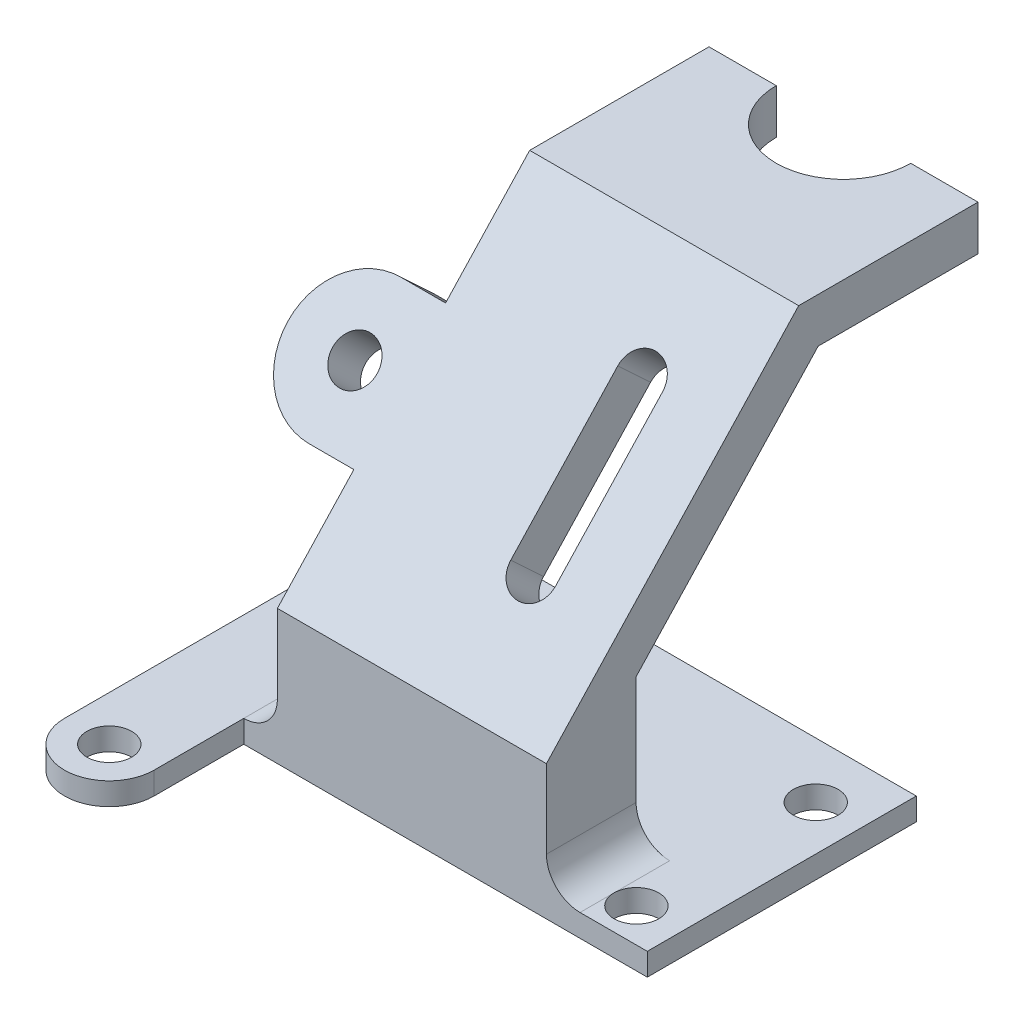
ISO-10303-21;
HEADER;
FILE_DESCRIPTION(('STEP AP214'),'2;1');
FILE_NAME('part.step','',(''),(''),'','','');
FILE_SCHEMA(('AUTOMOTIVE_DESIGN { 1 0 10303 214 1 1 1 1 }'));
ENDSEC;
DATA;
#1=APPLICATION_CONTEXT('core data for automotive mechanical design processes');
#2=APPLICATION_PROTOCOL_DEFINITION('international standard','automotive_design',2000,#1);
#3=PRODUCT_CONTEXT('',#1,'mechanical');
#4=PRODUCT('Part','Part','',(#3));
#5=PRODUCT_RELATED_PRODUCT_CATEGORY('part','',(#4));
#6=PRODUCT_DEFINITION_FORMATION('','',#4);
#7=PRODUCT_DEFINITION_CONTEXT('part definition',#1,'design');
#8=PRODUCT_DEFINITION('design','',#6,#7);
#9=PRODUCT_DEFINITION_SHAPE('','',#8);
#10=(LENGTH_UNIT() NAMED_UNIT(*) SI_UNIT(.MILLI.,.METRE.));
#11=(NAMED_UNIT(*) PLANE_ANGLE_UNIT() SI_UNIT($,.RADIAN.));
#12=(NAMED_UNIT(*) SI_UNIT($,.STERADIAN.) SOLID_ANGLE_UNIT());
#13=UNCERTAINTY_MEASURE_WITH_UNIT(LENGTH_MEASURE(1.E-05),#10,'distance_accuracy_value','');
#14=(GEOMETRIC_REPRESENTATION_CONTEXT(3) GLOBAL_UNCERTAINTY_ASSIGNED_CONTEXT((#13)) GLOBAL_UNIT_ASSIGNED_CONTEXT((#10,
#11,#12)) REPRESENTATION_CONTEXT('',''));
#15=CARTESIAN_POINT('',(0.,0.,0.));
#16=DIRECTION('',(0.,0.,1.));
#17=DIRECTION('',(1.,0.,0.));
#18=AXIS2_PLACEMENT_3D('',#15,#16,#17);
#19=CARTESIAN_POINT('',(-7.22328931572629,36.1346721534327,-38.5059458820624));
#20=DIRECTION('',(0.,0.,-1.));
#21=DIRECTION('',(-1.,0.,0.));
#22=AXIS2_PLACEMENT_3D('',#19,#20,#21);
#23=PLANE('',#22);
#24=DIRECTION('',(0.,1.,0.));
#25=VECTOR('',#24,1.);
#26=CARTESIAN_POINT('',(-1.22328931572629,0.,-38.5059458820624));
#27=LINE('',#26,#25);
#28=CARTESIAN_POINT('',(-1.22328931572629,32.1346721534327,-38.5059458820624));
#29=VERTEX_POINT('',#28);
#30=CARTESIAN_POINT('',(-1.22328931572629,36.1346721534327,-38.5059458820624));
#31=VERTEX_POINT('',#30);
#32=EDGE_CURVE('E211',#29,#31,#27,.T.);
#33=ORIENTED_EDGE('',*,*,#32,.F.);
#34=DIRECTION('',(1.,0.,0.));
#35=VECTOR('',#34,1.);
#36=CARTESIAN_POINT('',(-7.22328931572629,32.1346721534327,-38.5059458820624));
#37=LINE('',#36,#35);
#38=CARTESIAN_POINT('',(-7.22328931572629,32.1346721534327,-38.5059458820624));
#39=VERTEX_POINT('',#38);
#40=EDGE_CURVE('E229',#39,#29,#37,.T.);
#41=ORIENTED_EDGE('',*,*,#40,.F.);
#42=DIRECTION('',(0.,1.,0.));
#43=VECTOR('',#42,1.);
#44=CARTESIAN_POINT('',(-7.22328931572629,36.1346721534327,-38.5059458820624));
#45=LINE('',#44,#43);
#46=CARTESIAN_POINT('',(-7.22328931572629,36.1346721534327,-38.5059458820624));
#47=VERTEX_POINT('',#46);
#48=EDGE_CURVE('E844',#39,#47,#45,.T.);
#49=ORIENTED_EDGE('',*,*,#48,.T.);
#50=DIRECTION('',(1.,0.,0.));
#51=VECTOR('',#50,1.);
#52=CARTESIAN_POINT('',(-7.22328931572629,36.1346721534327,-38.5059458820624));
#53=LINE('',#52,#51);
#54=EDGE_CURVE('E228',#47,#31,#53,.T.);
#55=ORIENTED_EDGE('',*,*,#54,.T.);
#56=EDGE_LOOP('',(#33,#41,#49,#55));
#57=FACE_BOUND('',#56,.T.);
#58=ADVANCED_FACE('F38',(#57),#23,.T.);
#59=CARTESIAN_POINT('',(-7.22328931572629,0.,-8.));
#60=DIRECTION('',(1.,0.,0.));
#61=DIRECTION('',(0.,1.,0.));
#62=AXIS2_PLACEMENT_3D('',#59,#60,#61);
#63=PLANE('',#62);
#64=DIRECTION('',(0.,-0.731353701619172,0.681998360062496));
#65=VECTOR('',#64,1.);
#66=CARTESIAN_POINT('',(-7.22328931572629,12.,0.));
#67=LINE('',#66,#65);
#68=CARTESIAN_POINT('',(-7.22328931572629,19.3135370161917,-6.81998360062497));
#69=VERTEX_POINT('',#68);
#70=CARTESIAN_POINT('',(-7.22328931572629,12.,0.));
#71=VERTEX_POINT('',#70);
#72=EDGE_CURVE('E848',#69,#71,#67,.T.);
#73=ORIENTED_EDGE('',*,*,#72,.F.);
#74=DIRECTION('',(0.,0.681998360062497,0.731353701619172));
#75=VECTOR('',#74,1.);
#76=CARTESIAN_POINT('',(-7.22328931572629,16.5855435759417,-9.74539840710166));
#77=LINE('',#76,#75);
#78=CARTESIAN_POINT('',(-7.22328931572629,16.5855435759417,-9.74539840710166));
#79=VERTEX_POINT('',#78);
#80=EDGE_CURVE('E821',#79,#69,#77,.T.);
#81=ORIENTED_EDGE('',*,*,#80,.F.);
#82=DIRECTION('',(0.,0.731353701619172,-0.681998360062496));
#83=VECTOR('',#82,1.);
#84=CARTESIAN_POINT('',(-7.22328931572629,14.713832937639,-8.));
#85=LINE('',#84,#83);
#86=CARTESIAN_POINT('',(-7.22328931572629,14.713832937639,-8.));
#87=VERTEX_POINT('',#86);
#88=EDGE_CURVE('E809',#87,#79,#85,.T.);
#89=ORIENTED_EDGE('',*,*,#88,.F.);
#90=DIRECTION('',(0.,1.,0.));
#91=VECTOR('',#90,1.);
#92=CARTESIAN_POINT('',(-7.22328931572629,0.,-8.));
#93=LINE('',#92,#91);
#94=CARTESIAN_POINT('',(-7.22328931572629,5.,-8.));
#95=VERTEX_POINT('',#94);
#96=EDGE_CURVE('E293',#95,#87,#93,.T.);
#97=ORIENTED_EDGE('',*,*,#96,.F.);
#98=DIRECTION('',(0.,0.,1.));
#99=VECTOR('',#98,1.);
#100=CARTESIAN_POINT('',(-7.22328931572629,5.,-8.));
#101=LINE('',#100,#99);
#102=CARTESIAN_POINT('',(-7.22328931572629,5.,0.));
#103=VERTEX_POINT('',#102);
#104=EDGE_CURVE('E319',#95,#103,#101,.T.);
#105=ORIENTED_EDGE('',*,*,#104,.T.);
#106=DIRECTION('',(0.,1.,0.));
#107=VECTOR('',#106,1.);
#108=CARTESIAN_POINT('',(-7.22328931572629,0.,0.));
#109=LINE('',#108,#107);
#110=EDGE_CURVE('E307',#103,#71,#109,.T.);
#111=ORIENTED_EDGE('',*,*,#110,.T.);
#112=EDGE_LOOP('',(#73,#81,#89,#97,#105,#111));
#113=FACE_BOUND('',#112,.T.);
#114=ADVANCED_FACE('F399',(#113),#63,.F.);
#115=CARTESIAN_POINT('',(0.,2.,-24.));
#116=DIRECTION('',(0.,-1.,0.));
#117=DIRECTION('',(1.,0.,0.));
#118=AXIS2_PLACEMENT_3D('',#115,#116,#117);
#119=PLANE('',#118);
#120=CARTESIAN_POINT('',(21.7767106842737,2.,-19.0277142332653));
#121=DIRECTION('',(0.,1.,0.));
#122=DIRECTION('',(-1.,0.,0.));
#123=AXIS2_PLACEMENT_3D('',#120,#121,#122);
#124=CIRCLE('',#123,2.);
#125=CARTESIAN_POINT('',(19.7767106842737,2.,-19.0277142332653));
#126=VERTEX_POINT('',#125);
#127=EDGE_CURVE('E249',#126,#126,#124,.T.);
#128=ORIENTED_EDGE('',*,*,#127,.F.);
#129=EDGE_LOOP('',(#128));
#130=FACE_BOUND('',#129,.T.);
#131=CARTESIAN_POINT('',(-14.2232893157263,2.,-19.0277142332653));
#132=DIRECTION('',(0.,1.,0.));
#133=DIRECTION('',(-1.,0.,0.));
#134=AXIS2_PLACEMENT_3D('',#131,#132,#133);
#135=CIRCLE('',#134,2.);
#136=CARTESIAN_POINT('',(-16.2232893157263,2.,-19.0277142332653));
#137=VERTEX_POINT('',#136);
#138=EDGE_CURVE('E255',#137,#137,#135,.T.);
#139=ORIENTED_EDGE('',*,*,#138,.F.);
#140=EDGE_LOOP('',(#139));
#141=FACE_BOUND('',#140,.T.);
#142=DIRECTION('',(0.,0.,1.));
#143=VECTOR('',#142,1.);
#144=CARTESIAN_POINT('',(19.7767106842737,2.,-8.));
#145=LINE('',#144,#143);
#146=CARTESIAN_POINT('',(19.7767106842737,2.,-8.));
#147=VERTEX_POINT('',#146);
#148=CARTESIAN_POINT('',(19.7767106842737,2.,-3.02771423326528));
#149=VERTEX_POINT('',#148);
#150=EDGE_CURVE('E311',#147,#149,#145,.T.);
#151=ORIENTED_EDGE('',*,*,#150,.T.);
#152=CARTESIAN_POINT('',(21.7767106842737,2.,-3.02771423326528));
#153=DIRECTION('',(0.,1.,0.));
#154=DIRECTION('',(-1.,0.,0.));
#155=AXIS2_PLACEMENT_3D('',#152,#153,#154);
#156=CIRCLE('',#155,2.);
#157=EDGE_CURVE('E247',#149,#149,#156,.T.);
#158=ORIENTED_EDGE('',*,*,#157,.F.);
#159=CARTESIAN_POINT('',(19.7767106842737,2.,0.));
#160=VERTEX_POINT('',#159);
#161=EDGE_CURVE('E315',#149,#160,#145,.T.);
#162=ORIENTED_EDGE('',*,*,#161,.T.);
#163=DIRECTION('',(1.,0.,0.));
#164=VECTOR('',#163,1.);
#165=CARTESIAN_POINT('',(0.,2.,0.));
#166=LINE('',#165,#164);
#167=CARTESIAN_POINT('',(25.7767106842737,2.,0.));
#168=VERTEX_POINT('',#167);
#169=EDGE_CURVE('E314',#160,#168,#166,.T.);
#170=ORIENTED_EDGE('',*,*,#169,.T.);
#171=DIRECTION('',(0.,0.,1.));
#172=VECTOR('',#171,1.);
#173=CARTESIAN_POINT('',(25.7767106842737,2.,-24.));
#174=LINE('',#173,#172);
#175=CARTESIAN_POINT('',(25.7767106842737,2.,-24.));
#176=VERTEX_POINT('',#175);
#177=EDGE_CURVE('E46',#176,#168,#174,.T.);
#178=ORIENTED_EDGE('',*,*,#177,.F.);
#179=DIRECTION('',(1.,0.,0.));
#180=VECTOR('',#179,1.);
#181=CARTESIAN_POINT('',(0.,2.,-24.));
#182=LINE('',#181,#180);
#183=CARTESIAN_POINT('',(-18.2232893157263,2.,-24.));
#184=VERTEX_POINT('',#183);
#185=EDGE_CURVE('E324',#184,#176,#182,.T.);
#186=ORIENTED_EDGE('',*,*,#185,.F.);
#187=DIRECTION('',(0.,0.,1.));
#188=VECTOR('',#187,1.);
#189=CARTESIAN_POINT('',(-18.2232893157263,2.,-24.));
#190=LINE('',#189,#188);
#191=CARTESIAN_POINT('',(-18.2232893157263,2.,8.));
#192=VERTEX_POINT('',#191);
#193=EDGE_CURVE('E335',#184,#192,#190,.T.);
#194=ORIENTED_EDGE('',*,*,#193,.T.);
#195=CARTESIAN_POINT('',(-14.2232893157263,2.,8.));
#196=DIRECTION('',(0.,1.,0.));
#197=DIRECTION('',(-1.,0.,0.));
#198=AXIS2_PLACEMENT_3D('',#195,#196,#197);
#199=CIRCLE('',#198,4.);
#200=CARTESIAN_POINT('',(-10.2232893157263,2.,8.));
#201=VERTEX_POINT('',#200);
#202=EDGE_CURVE('E264',#192,#201,#199,.T.);
#203=ORIENTED_EDGE('',*,*,#202,.T.);
#204=DIRECTION('',(0.,0.,-1.));
#205=VECTOR('',#204,1.);
#206=CARTESIAN_POINT('',(-10.2232893157263,2.,0.));
#207=LINE('',#206,#205);
#208=CARTESIAN_POINT('',(-10.2232893157263,2.,0.));
#209=VERTEX_POINT('',#208);
#210=EDGE_CURVE('E271',#201,#209,#207,.T.);
#211=ORIENTED_EDGE('',*,*,#210,.T.);
#212=DIRECTION('',(0.,0.,1.));
#213=VECTOR('',#212,1.);
#214=CARTESIAN_POINT('',(-10.2232893157263,2.,-8.));
#215=LINE('',#214,#213);
#216=CARTESIAN_POINT('',(-10.2232893157263,2.,-8.));
#217=VERTEX_POINT('',#216);
#218=EDGE_CURVE('E316',#217,#209,#215,.T.);
#219=ORIENTED_EDGE('',*,*,#218,.F.);
#220=DIRECTION('',(1.,0.,0.));
#221=VECTOR('',#220,1.);
#222=CARTESIAN_POINT('',(0.,2.,-8.));
#223=LINE('',#222,#221);
#224=EDGE_CURVE('E297',#217,#147,#223,.T.);
#225=ORIENTED_EDGE('',*,*,#224,.T.);
#226=EDGE_LOOP('',(#151,#158,#162,#170,#178,#186,#194,#203,#211,#219,#225));
#227=FACE_BOUND('',#226,.T.);
#228=CARTESIAN_POINT('',(-14.2232893157263,2.,8.));
#229=DIRECTION('',(0.,1.,0.));
#230=DIRECTION('',(-1.,0.,0.));
#231=AXIS2_PLACEMENT_3D('',#228,#229,#230);
#232=CIRCLE('',#231,2.);
#233=CARTESIAN_POINT('',(-16.2232893157263,2.,8.));
#234=VERTEX_POINT('',#233);
#235=EDGE_CURVE('E246',#234,#234,#232,.T.);
#236=ORIENTED_EDGE('',*,*,#235,.F.);
#237=EDGE_LOOP('',(#236));
#238=FACE_BOUND('',#237,.T.);
#239=ADVANCED_FACE('F40',(#130,#141,#227,#238),#119,.F.);
#240=CARTESIAN_POINT('',(25.7767106842737,0.,-24.));
#241=DIRECTION('',(1.,0.,0.));
#242=DIRECTION('',(0.,0.,-1.));
#243=AXIS2_PLACEMENT_3D('',#240,#241,#242);
#244=PLANE('',#243);
#245=DIRECTION('',(0.,1.,0.));
#246=VECTOR('',#245,1.);
#247=CARTESIAN_POINT('',(25.7767106842737,0.,0.));
#248=LINE('',#247,#246);
#249=CARTESIAN_POINT('',(25.7767106842737,0.,0.));
#250=VERTEX_POINT('',#249);
#251=EDGE_CURVE('E327',#250,#168,#248,.T.);
#252=ORIENTED_EDGE('',*,*,#251,.F.);
#253=DIRECTION('',(0.,0.,1.));
#254=VECTOR('',#253,1.);
#255=CARTESIAN_POINT('',(25.7767106842737,0.,-24.));
#256=LINE('',#255,#254);
#257=CARTESIAN_POINT('',(25.7767106842737,0.,-24.));
#258=VERTEX_POINT('',#257);
#259=EDGE_CURVE('E343',#258,#250,#256,.T.);
#260=ORIENTED_EDGE('',*,*,#259,.F.);
#261=DIRECTION('',(0.,1.,0.));
#262=VECTOR('',#261,1.);
#263=CARTESIAN_POINT('',(25.7767106842737,0.,-24.));
#264=LINE('',#263,#262);
#265=EDGE_CURVE('E332',#258,#176,#264,.T.);
#266=ORIENTED_EDGE('',*,*,#265,.T.);
#267=ORIENTED_EDGE('',*,*,#177,.T.);
#268=EDGE_LOOP('',(#252,#260,#266,#267));
#269=FACE_BOUND('',#268,.T.);
#270=ADVANCED_FACE('F703',(#269),#244,.T.);
#271=CARTESIAN_POINT('',(0.,0.,-24.));
#272=DIRECTION('',(0.,-1.,0.));
#273=DIRECTION('',(0.,0.,-1.));
#274=AXIS2_PLACEMENT_3D('',#271,#272,#273);
#275=PLANE('',#274);
#276=CARTESIAN_POINT('',(21.7767106842737,0.,-3.02771423326528));
#277=DIRECTION('',(0.,1.,0.));
#278=DIRECTION('',(-1.,0.,0.));
#279=AXIS2_PLACEMENT_3D('',#276,#277,#278);
#280=CIRCLE('',#279,2.);
#281=CARTESIAN_POINT('',(19.7767106842737,0.,-3.02771423326528));
#282=VERTEX_POINT('',#281);
#283=EDGE_CURVE('E243',#282,#282,#280,.T.);
#284=ORIENTED_EDGE('',*,*,#283,.T.);
#285=EDGE_LOOP('',(#284));
#286=FACE_BOUND('',#285,.T.);
#287=CARTESIAN_POINT('',(21.7767106842737,0.,-19.0277142332653));
#288=DIRECTION('',(0.,1.,0.));
#289=DIRECTION('',(-1.,0.,0.));
#290=AXIS2_PLACEMENT_3D('',#287,#288,#289);
#291=CIRCLE('',#290,2.);
#292=CARTESIAN_POINT('',(19.7767106842737,0.,-19.0277142332653));
#293=VERTEX_POINT('',#292);
#294=EDGE_CURVE('E252',#293,#293,#291,.T.);
#295=ORIENTED_EDGE('',*,*,#294,.T.);
#296=EDGE_LOOP('',(#295));
#297=FACE_BOUND('',#296,.T.);
#298=CARTESIAN_POINT('',(-14.2232893157263,0.,-19.0277142332653));
#299=DIRECTION('',(0.,1.,0.));
#300=DIRECTION('',(-1.,0.,0.));
#301=AXIS2_PLACEMENT_3D('',#298,#299,#300);
#302=CIRCLE('',#301,2.);
#303=CARTESIAN_POINT('',(-16.2232893157263,0.,-19.0277142332653));
#304=VERTEX_POINT('',#303);
#305=EDGE_CURVE('E258',#304,#304,#302,.T.);
#306=ORIENTED_EDGE('',*,*,#305,.T.);
#307=EDGE_LOOP('',(#306));
#308=FACE_BOUND('',#307,.T.);
#309=DIRECTION('',(1.,0.,0.));
#310=VECTOR('',#309,1.);
#311=CARTESIAN_POINT('',(0.,0.,0.));
#312=LINE('',#311,#310);
#313=CARTESIAN_POINT('',(-10.2232893157263,0.,0.));
#314=VERTEX_POINT('',#313);
#315=EDGE_CURVE('E337',#314,#250,#312,.T.);
#316=ORIENTED_EDGE('',*,*,#315,.F.);
#317=DIRECTION('',(0.,0.,-1.));
#318=VECTOR('',#317,1.);
#319=CARTESIAN_POINT('',(-10.2232893157263,0.,0.));
#320=LINE('',#319,#318);
#321=CARTESIAN_POINT('',(-10.2232893157263,0.,8.));
#322=VERTEX_POINT('',#321);
#323=EDGE_CURVE('E270',#322,#314,#320,.T.);
#324=ORIENTED_EDGE('',*,*,#323,.F.);
#325=CARTESIAN_POINT('',(-14.2232893157263,0.,8.));
#326=DIRECTION('',(0.,1.,0.));
#327=DIRECTION('',(-1.,0.,0.));
#328=AXIS2_PLACEMENT_3D('',#325,#326,#327);
#329=CIRCLE('',#328,4.);
#330=CARTESIAN_POINT('',(-18.2232893157263,0.,8.));
#331=VERTEX_POINT('',#330);
#332=EDGE_CURVE('E267',#331,#322,#329,.T.);
#333=ORIENTED_EDGE('',*,*,#332,.F.);
#334=DIRECTION('',(0.,0.,1.));
#335=VECTOR('',#334,1.);
#336=CARTESIAN_POINT('',(-18.2232893157263,0.,-24.));
#337=LINE('',#336,#335);
#338=CARTESIAN_POINT('',(-18.2232893157263,0.,-24.));
#339=VERTEX_POINT('',#338);
#340=EDGE_CURVE('E346',#339,#331,#337,.T.);
#341=ORIENTED_EDGE('',*,*,#340,.F.);
#342=DIRECTION('',(1.,0.,0.));
#343=VECTOR('',#342,1.);
#344=CARTESIAN_POINT('',(0.,0.,-24.));
#345=LINE('',#344,#343);
#346=EDGE_CURVE('E329',#339,#258,#345,.T.);
#347=ORIENTED_EDGE('',*,*,#346,.T.);
#348=ORIENTED_EDGE('',*,*,#259,.T.);
#349=EDGE_LOOP('',(#316,#324,#333,#341,#347,#348));
#350=FACE_BOUND('',#349,.T.);
#351=CARTESIAN_POINT('',(-14.2232893157263,0.,8.));
#352=DIRECTION('',(0.,1.,0.));
#353=DIRECTION('',(-1.,0.,0.));
#354=AXIS2_PLACEMENT_3D('',#351,#352,#353);
#355=CIRCLE('',#354,2.);
#356=CARTESIAN_POINT('',(-16.2232893157263,0.,8.));
#357=VERTEX_POINT('',#356);
#358=EDGE_CURVE('E261',#357,#357,#355,.T.);
#359=ORIENTED_EDGE('',*,*,#358,.T.);
#360=EDGE_LOOP('',(#359));
#361=FACE_BOUND('',#360,.T.);
#362=ADVANCED_FACE('F695',(#286,#297,#308,#350,#361),#275,.T.);
#363=CARTESIAN_POINT('',(-18.2232893157263,0.,-24.));
#364=DIRECTION('',(1.,0.,0.));
#365=DIRECTION('',(0.,0.,-1.));
#366=AXIS2_PLACEMENT_3D('',#363,#364,#365);
#367=PLANE('',#366);
#368=ORIENTED_EDGE('',*,*,#340,.T.);
#369=DIRECTION('',(0.,1.,0.));
#370=VECTOR('',#369,1.);
#371=CARTESIAN_POINT('',(-18.2232893157263,0.,8.));
#372=LINE('',#371,#370);
#373=EDGE_CURVE('E274',#331,#192,#372,.T.);
#374=ORIENTED_EDGE('',*,*,#373,.T.);
#375=ORIENTED_EDGE('',*,*,#193,.F.);
#376=DIRECTION('',(0.,1.,0.));
#377=VECTOR('',#376,1.);
#378=CARTESIAN_POINT('',(-18.2232893157263,0.,-24.));
#379=LINE('',#378,#377);
#380=EDGE_CURVE('E326',#339,#184,#379,.T.);
#381=ORIENTED_EDGE('',*,*,#380,.F.);
#382=EDGE_LOOP('',(#368,#374,#375,#381));
#383=FACE_BOUND('',#382,.T.);
#384=ADVANCED_FACE('F356',(#383),#367,.F.);
#385=CARTESIAN_POINT('',(0.,0.,-24.));
#386=DIRECTION('',(0.,0.,1.));
#387=DIRECTION('',(1.,0.,0.));
#388=AXIS2_PLACEMENT_3D('',#385,#386,#387);
#389=PLANE('',#388);
#390=ORIENTED_EDGE('',*,*,#185,.T.);
#391=ORIENTED_EDGE('',*,*,#265,.F.);
#392=ORIENTED_EDGE('',*,*,#346,.F.);
#393=ORIENTED_EDGE('',*,*,#380,.T.);
#394=EDGE_LOOP('',(#390,#391,#392,#393));
#395=FACE_BOUND('',#394,.T.);
#396=ADVANCED_FACE('F677',(#395),#389,.F.);
#397=CARTESIAN_POINT('',(0.,0.,0.));
#398=DIRECTION('',(0.,0.,1.));
#399=DIRECTION('',(1.,0.,0.));
#400=AXIS2_PLACEMENT_3D('',#397,#398,#399);
#401=PLANE('',#400);
#402=DIRECTION('',(0.,1.,0.));
#403=VECTOR('',#402,1.);
#404=CARTESIAN_POINT('',(-10.2232893157263,0.,0.));
#405=LINE('',#404,#403);
#406=EDGE_CURVE('E279',#314,#209,#405,.T.);
#407=ORIENTED_EDGE('',*,*,#406,.F.);
#408=ORIENTED_EDGE('',*,*,#315,.T.);
#409=ORIENTED_EDGE('',*,*,#251,.T.);
#410=ORIENTED_EDGE('',*,*,#169,.F.);
#411=CARTESIAN_POINT('',(19.7767106842737,5.,0.));
#412=DIRECTION('',(0.,0.,1.));
#413=DIRECTION('',(1.,0.,0.));
#414=AXIS2_PLACEMENT_3D('',#411,#412,#413);
#415=CIRCLE('',#414,3.);
#416=CARTESIAN_POINT('',(16.7767106842737,5.,0.));
#417=VERTEX_POINT('',#416);
#418=EDGE_CURVE('E282',#417,#160,#415,.T.);
#419=ORIENTED_EDGE('',*,*,#418,.F.);
#420=DIRECTION('',(0.,-1.,0.));
#421=VECTOR('',#420,1.);
#422=CARTESIAN_POINT('',(16.7767106842737,0.,0.));
#423=LINE('',#422,#421);
#424=CARTESIAN_POINT('',(16.7767106842737,12.,0.));
#425=VERTEX_POINT('',#424);
#426=EDGE_CURVE('E302',#425,#417,#423,.T.);
#427=ORIENTED_EDGE('',*,*,#426,.F.);
#428=DIRECTION('',(1.,0.,0.));
#429=VECTOR('',#428,1.);
#430=CARTESIAN_POINT('',(0.,12.,0.));
#431=LINE('',#430,#429);
#432=EDGE_CURVE('E304',#71,#425,#431,.T.);
#433=ORIENTED_EDGE('',*,*,#432,.F.);
#434=ORIENTED_EDGE('',*,*,#110,.F.);
#435=CARTESIAN_POINT('',(-10.2232893157263,5.,0.));
#436=DIRECTION('',(0.,0.,1.));
#437=DIRECTION('',(1.,0.,0.));
#438=AXIS2_PLACEMENT_3D('',#435,#436,#437);
#439=CIRCLE('',#438,3.);
#440=EDGE_CURVE('E291',#209,#103,#439,.T.);
#441=ORIENTED_EDGE('',*,*,#440,.F.);
#442=EDGE_LOOP('',(#407,#408,#409,#410,#419,#427,#433,#434,#441));
#443=FACE_BOUND('',#442,.T.);
#444=ADVANCED_FACE('F667',(#443),#401,.T.);
#445=CARTESIAN_POINT('',(19.7767106842737,5.,-8.));
#446=DIRECTION('',(0.,0.,1.));
#447=DIRECTION('',(1.,0.,0.));
#448=AXIS2_PLACEMENT_3D('',#445,#446,#447);
#449=CYLINDRICAL_SURFACE('',#448,3.);
#450=ORIENTED_EDGE('',*,*,#418,.T.);
#451=ORIENTED_EDGE('',*,*,#161,.F.);
#452=ORIENTED_EDGE('',*,*,#150,.F.);
#453=CARTESIAN_POINT('',(19.7767106842737,5.,-8.));
#454=DIRECTION('',(0.,0.,1.));
#455=DIRECTION('',(1.,0.,0.));
#456=AXIS2_PLACEMENT_3D('',#453,#454,#455);
#457=CIRCLE('',#456,3.);
#458=CARTESIAN_POINT('',(16.7767106842737,5.,-8.));
#459=VERTEX_POINT('',#458);
#460=EDGE_CURVE('E287',#459,#147,#457,.T.);
#461=ORIENTED_EDGE('',*,*,#460,.F.);
#462=DIRECTION('',(0.,0.,1.));
#463=VECTOR('',#462,1.);
#464=CARTESIAN_POINT('',(16.7767106842737,5.,-8.));
#465=LINE('',#464,#463);
#466=EDGE_CURVE('E299',#459,#417,#465,.T.);
#467=ORIENTED_EDGE('',*,*,#466,.T.);
#468=EDGE_LOOP('',(#450,#451,#452,#461,#467));
#469=FACE_BOUND('',#468,.T.);
#470=ADVANCED_FACE('F377',(#469),#449,.F.);
#471=CARTESIAN_POINT('',(-10.2232893157263,5.,-8.));
#472=DIRECTION('',(0.,0.,1.));
#473=DIRECTION('',(1.,0.,0.));
#474=AXIS2_PLACEMENT_3D('',#471,#472,#473);
#475=CYLINDRICAL_SURFACE('',#474,3.);
#476=ORIENTED_EDGE('',*,*,#440,.T.);
#477=ORIENTED_EDGE('',*,*,#104,.F.);
#478=CARTESIAN_POINT('',(-10.2232893157263,5.,-8.));
#479=DIRECTION('',(0.,0.,1.));
#480=DIRECTION('',(1.,0.,0.));
#481=AXIS2_PLACEMENT_3D('',#478,#479,#480);
#482=CIRCLE('',#481,3.);
#483=EDGE_CURVE('E295',#217,#95,#482,.T.);
#484=ORIENTED_EDGE('',*,*,#483,.F.);
#485=ORIENTED_EDGE('',*,*,#218,.T.);
#486=EDGE_LOOP('',(#476,#477,#484,#485));
#487=FACE_BOUND('',#486,.T.);
#488=ADVANCED_FACE('F368',(#487),#475,.F.);
#489=CARTESIAN_POINT('',(-7.22328931572629,25.3617879953718,-17.9293787278516));
#490=VERTEX_POINT('',#489);
#491=CARTESIAN_POINT('',(-7.22328931572629,32.1346721534327,-24.2451953819061));
#492=VERTEX_POINT('',#491);
#493=EDGE_CURVE('E833',#490,#492,#85,.T.);
#494=ORIENTED_EDGE('',*,*,#493,.F.);
#495=DIRECTION('',(0.,0.681998360062497,0.731353701619172));
#496=VECTOR('',#495,1.);
#497=CARTESIAN_POINT('',(-7.22328931572629,25.3617879953718,-17.9293787278516));
#498=LINE('',#497,#496);
#499=CARTESIAN_POINT('',(-7.22328931572629,28.0897814356218,-15.0039639213749));
#500=VERTEX_POINT('',#499);
#501=EDGE_CURVE('E840',#490,#500,#498,.T.);
#502=ORIENTED_EDGE('',*,*,#501,.T.);
#503=CARTESIAN_POINT('',(-7.22328931572629,36.1346721534327,-22.5059458820624));
#504=VERTEX_POINT('',#503);
#505=EDGE_CURVE('E242',#504,#500,#67,.T.);
#506=ORIENTED_EDGE('',*,*,#505,.F.);
#507=DIRECTION('',(0.,0.,1.));
#508=VECTOR('',#507,1.);
#509=CARTESIAN_POINT('',(-7.22328931572629,36.1346721534327,-22.5059458820624));
#510=LINE('',#509,#508);
#511=EDGE_CURVE('E846',#47,#504,#510,.T.);
#512=ORIENTED_EDGE('',*,*,#511,.F.);
#513=ORIENTED_EDGE('',*,*,#48,.F.);
#514=DIRECTION('',(0.,0.,-1.));
#515=VECTOR('',#514,1.);
#516=CARTESIAN_POINT('',(-7.22328931572629,32.1346721534327,-38.5059458820624));
#517=LINE('',#516,#515);
#518=EDGE_CURVE('E837',#492,#39,#517,.T.);
#519=ORIENTED_EDGE('',*,*,#518,.F.);
#520=EDGE_LOOP('',(#494,#502,#506,#512,#513,#519));
#521=FACE_BOUND('',#520,.T.);
#522=ADVANCED_FACE('F407',(#521),#63,.F.);
#523=CARTESIAN_POINT('',(16.7767106842737,0.,-8.));
#524=DIRECTION('',(-1.,0.,0.));
#525=DIRECTION('',(0.,0.,1.));
#526=AXIS2_PLACEMENT_3D('',#523,#524,#525);
#527=PLANE('',#526);
#528=ORIENTED_EDGE('',*,*,#426,.T.);
#529=ORIENTED_EDGE('',*,*,#466,.F.);
#530=DIRECTION('',(0.,-1.,0.));
#531=VECTOR('',#530,1.);
#532=CARTESIAN_POINT('',(16.7767106842737,0.,-8.));
#533=LINE('',#532,#531);
#534=CARTESIAN_POINT('',(16.7767106842737,14.713832937639,-8.));
#535=VERTEX_POINT('',#534);
#536=EDGE_CURVE('E290',#535,#459,#533,.T.);
#537=ORIENTED_EDGE('',*,*,#536,.F.);
#538=DIRECTION('',(0.,0.731353701619171,-0.681998360062498));
#539=VECTOR('',#538,1.);
#540=CARTESIAN_POINT('',(16.7767106842737,32.1346721534327,-24.2451953819061));
#541=LINE('',#540,#539);
#542=CARTESIAN_POINT('',(16.7767106842737,32.1346721534327,-24.2451953819061));
#543=VERTEX_POINT('',#542);
#544=EDGE_CURVE('E816',#535,#543,#541,.T.);
#545=ORIENTED_EDGE('',*,*,#544,.T.);
#546=DIRECTION('',(0.,0.,-1.));
#547=VECTOR('',#546,1.);
#548=CARTESIAN_POINT('',(16.7767106842737,32.1346721534327,-38.5059458820624));
#549=LINE('',#548,#547);
#550=CARTESIAN_POINT('',(16.7767106842737,32.1346721534327,-38.5059458820624));
#551=VERTEX_POINT('',#550);
#552=EDGE_CURVE('E820',#543,#551,#549,.T.);
#553=ORIENTED_EDGE('',*,*,#552,.T.);
#554=DIRECTION('',(0.,1.,0.));
#555=VECTOR('',#554,1.);
#556=CARTESIAN_POINT('',(16.7767106842737,36.1346721534327,-38.5059458820624));
#557=LINE('',#556,#555);
#558=CARTESIAN_POINT('',(16.7767106842737,36.1346721534327,-38.5059458820624));
#559=VERTEX_POINT('',#558);
#560=EDGE_CURVE('E823',#551,#559,#557,.T.);
#561=ORIENTED_EDGE('',*,*,#560,.T.);
#562=DIRECTION('',(0.,0.,1.));
#563=VECTOR('',#562,1.);
#564=CARTESIAN_POINT('',(16.7767106842737,36.1346721534327,-22.5059458820624));
#565=LINE('',#564,#563);
#566=CARTESIAN_POINT('',(16.7767106842737,36.1346721534327,-22.5059458820624));
#567=VERTEX_POINT('',#566);
#568=EDGE_CURVE('E226',#559,#567,#565,.T.);
#569=ORIENTED_EDGE('',*,*,#568,.T.);
#570=DIRECTION('',(0.,-0.731353701619172,0.681998360062496));
#571=VECTOR('',#570,1.);
#572=CARTESIAN_POINT('',(16.7767106842737,12.,0.));
#573=LINE('',#572,#571);
#574=EDGE_CURVE('E831',#567,#425,#573,.T.);
#575=ORIENTED_EDGE('',*,*,#574,.T.);
#576=EDGE_LOOP('',(#528,#529,#537,#545,#553,#561,#569,#575));
#577=FACE_BOUND('',#576,.T.);
#578=ADVANCED_FACE('F634',(#577),#527,.F.);
#579=CARTESIAN_POINT('',(0.,0.,-8.));
#580=DIRECTION('',(0.,0.,1.));
#581=DIRECTION('',(1.,0.,0.));
#582=AXIS2_PLACEMENT_3D('',#579,#580,#581);
#583=PLANE('',#582);
#584=ORIENTED_EDGE('',*,*,#460,.T.);
#585=ORIENTED_EDGE('',*,*,#224,.F.);
#586=ORIENTED_EDGE('',*,*,#483,.T.);
#587=ORIENTED_EDGE('',*,*,#96,.T.);
#588=DIRECTION('',(1.,0.,0.));
#589=VECTOR('',#588,1.);
#590=CARTESIAN_POINT('',(-7.22328931572629,14.713832937639,-8.));
#591=LINE('',#590,#589);
#592=EDGE_CURVE('E239',#87,#535,#591,.T.);
#593=ORIENTED_EDGE('',*,*,#592,.T.);
#594=ORIENTED_EDGE('',*,*,#536,.T.);
#595=EDGE_LOOP('',(#584,#585,#586,#587,#593,#594));
#596=FACE_BOUND('',#595,.T.);
#597=ADVANCED_FACE('F371',(#596),#583,.F.);
#598=CARTESIAN_POINT('',(-10.2232893157263,0.,0.));
#599=DIRECTION('',(1.,0.,0.));
#600=DIRECTION('',(0.,1.,0.));
#601=AXIS2_PLACEMENT_3D('',#598,#599,#600);
#602=PLANE('',#601);
#603=ORIENTED_EDGE('',*,*,#210,.F.);
#604=DIRECTION('',(0.,1.,0.));
#605=VECTOR('',#604,1.);
#606=CARTESIAN_POINT('',(-10.2232893157263,0.,8.));
#607=LINE('',#606,#605);
#608=EDGE_CURVE('E283',#322,#201,#607,.T.);
#609=ORIENTED_EDGE('',*,*,#608,.F.);
#610=ORIENTED_EDGE('',*,*,#323,.T.);
#611=ORIENTED_EDGE('',*,*,#406,.T.);
#612=EDGE_LOOP('',(#603,#609,#610,#611));
#613=FACE_BOUND('',#612,.T.);
#614=ADVANCED_FACE('F363',(#613),#602,.T.);
#615=CARTESIAN_POINT('',(-14.2232893157263,0.,8.));
#616=DIRECTION('',(0.,1.,0.));
#617=DIRECTION('',(-1.,0.,0.));
#618=AXIS2_PLACEMENT_3D('',#615,#616,#617);
#619=CYLINDRICAL_SURFACE('',#618,4.);
#620=ORIENTED_EDGE('',*,*,#202,.F.);
#621=ORIENTED_EDGE('',*,*,#373,.F.);
#622=ORIENTED_EDGE('',*,*,#332,.T.);
#623=ORIENTED_EDGE('',*,*,#608,.T.);
#624=EDGE_LOOP('',(#620,#621,#622,#623));
#625=FACE_BOUND('',#624,.T.);
#626=ADVANCED_FACE('F359',(#625),#619,.T.);
#627=CARTESIAN_POINT('',(-14.2232893157263,0.,8.));
#628=DIRECTION('',(0.,1.,0.));
#629=DIRECTION('',(-1.,0.,0.));
#630=AXIS2_PLACEMENT_3D('',#627,#628,#629);
#631=CYLINDRICAL_SURFACE('',#630,2.);
#632=ORIENTED_EDGE('',*,*,#358,.F.);
#633=EDGE_LOOP('',(#632));
#634=FACE_BOUND('',#633,.T.);
#635=ORIENTED_EDGE('',*,*,#235,.T.);
#636=EDGE_LOOP('',(#635));
#637=FACE_BOUND('',#636,.T.);
#638=ADVANCED_FACE('F598',(#634,#637),#631,.F.);
#639=CARTESIAN_POINT('',(-14.2232893157263,0.,-19.0277142332653));
#640=DIRECTION('',(0.,1.,0.));
#641=DIRECTION('',(-1.,0.,0.));
#642=AXIS2_PLACEMENT_3D('',#639,#640,#641);
#643=CYLINDRICAL_SURFACE('',#642,2.);
#644=ORIENTED_EDGE('',*,*,#305,.F.);
#645=EDGE_LOOP('',(#644));
#646=FACE_BOUND('',#645,.T.);
#647=ORIENTED_EDGE('',*,*,#138,.T.);
#648=EDGE_LOOP('',(#647));
#649=FACE_BOUND('',#648,.T.);
#650=ADVANCED_FACE('F393',(#646,#649),#643,.F.);
#651=CARTESIAN_POINT('',(21.7767106842737,0.,-19.0277142332653));
#652=DIRECTION('',(0.,1.,0.));
#653=DIRECTION('',(-1.,0.,0.));
#654=AXIS2_PLACEMENT_3D('',#651,#652,#653);
#655=CYLINDRICAL_SURFACE('',#654,2.);
#656=ORIENTED_EDGE('',*,*,#294,.F.);
#657=EDGE_LOOP('',(#656));
#658=FACE_BOUND('',#657,.T.);
#659=ORIENTED_EDGE('',*,*,#127,.T.);
#660=EDGE_LOOP('',(#659));
#661=FACE_BOUND('',#660,.T.);
#662=ADVANCED_FACE('F384',(#658,#661),#655,.F.);
#663=CARTESIAN_POINT('',(21.7767106842737,0.,-3.02771423326528));
#664=DIRECTION('',(0.,1.,0.));
#665=DIRECTION('',(-1.,0.,0.));
#666=AXIS2_PLACEMENT_3D('',#663,#664,#665);
#667=CYLINDRICAL_SURFACE('',#666,2.);
#668=ORIENTED_EDGE('',*,*,#283,.F.);
#669=EDGE_LOOP('',(#668));
#670=FACE_BOUND('',#669,.T.);
#671=ORIENTED_EDGE('',*,*,#157,.T.);
#672=EDGE_LOOP('',(#671));
#673=FACE_BOUND('',#672,.T.);
#674=ADVANCED_FACE('F381',(#670,#673),#667,.F.);
#675=CARTESIAN_POINT('',(-7.22328931572629,12.,0.));
#676=DIRECTION('',(0.,0.681998360062497,0.731353701619172));
#677=DIRECTION('',(0.,-0.731353701619172,0.681998360062497));
#678=AXIS2_PLACEMENT_3D('',#675,#676,#677);
#679=PLANE('',#678);
#680=DIRECTION('',(0.,-0.731353701619172,0.681998360062497));
#681=VECTOR('',#680,1.);
#682=CARTESIAN_POINT('',(6.77671068427372,5.58146115753522,5.98538430155894));
#683=LINE('',#682,#681);
#684=CARTESIAN_POINT('',(6.77671068427371,29.5524888388601,-16.3679606414999));
#685=VERTEX_POINT('',#684);
#686=CARTESIAN_POINT('',(6.77671068427371,19.3135370161917,-6.81998360062497));
#687=VERTEX_POINT('',#686);
#688=EDGE_CURVE('E60',#685,#687,#683,.T.);
#689=ORIENTED_EDGE('',*,*,#688,.F.);
#690=CARTESIAN_POINT('',(8.77671068427371,29.5524888388601,-16.3679606414999));
#691=DIRECTION('',(0.,0.681998360062497,0.731353701619172));
#692=DIRECTION('',(0.,-0.731353701619172,0.681998360062497));
#693=AXIS2_PLACEMENT_3D('',#690,#691,#692);
#694=CIRCLE('',#693,2.);
#695=CARTESIAN_POINT('',(10.7767106842737,29.5524888388601,-16.3679606414999));
#696=VERTEX_POINT('',#695);
#697=EDGE_CURVE('E896',#696,#685,#694,.T.);
#698=ORIENTED_EDGE('',*,*,#697,.F.);
#699=DIRECTION('',(0.,-0.731353701619172,0.681998360062497));
#700=VECTOR('',#699,1.);
#701=CARTESIAN_POINT('',(10.7767106842737,5.58146115753522,5.98538430155895));
#702=LINE('',#701,#700);
#703=CARTESIAN_POINT('',(10.7767106842737,19.3135370161917,-6.81998360062497));
#704=VERTEX_POINT('',#703);
#705=EDGE_CURVE('E900',#696,#704,#702,.T.);
#706=ORIENTED_EDGE('',*,*,#705,.T.);
#707=CARTESIAN_POINT('',(8.77671068427371,19.3135370161917,-6.81998360062497));
#708=DIRECTION('',(0.,0.681998360062497,0.731353701619172));
#709=DIRECTION('',(0.,-0.731353701619172,0.681998360062497));
#710=AXIS2_PLACEMENT_3D('',#707,#708,#709);
#711=CIRCLE('',#710,2.);
#712=EDGE_CURVE('E903',#687,#704,#711,.T.);
#713=ORIENTED_EDGE('',*,*,#712,.F.);
#714=EDGE_LOOP('',(#689,#698,#706,#713));
#715=FACE_BOUND('',#714,.T.);
#716=ORIENTED_EDGE('',*,*,#574,.F.);
#717=DIRECTION('',(1.,0.,0.));
#718=VECTOR('',#717,1.);
#719=CARTESIAN_POINT('',(-7.22328931572629,36.1346721534327,-22.5059458820624));
#720=LINE('',#719,#718);
#721=EDGE_CURVE('E231',#504,#567,#720,.T.);
#722=ORIENTED_EDGE('',*,*,#721,.F.);
#723=ORIENTED_EDGE('',*,*,#505,.T.);
#724=DIRECTION('',(-1.,0.,0.));
#725=VECTOR('',#724,1.);
#726=CARTESIAN_POINT('',(-7.22328931572629,28.0897814356218,-15.0039639213749));
#727=LINE('',#726,#725);
#728=CARTESIAN_POINT('',(-11.2232893157263,28.0897814356218,-15.0039639213749));
#729=VERTEX_POINT('',#728);
#730=EDGE_CURVE('E857',#500,#729,#727,.T.);
#731=ORIENTED_EDGE('',*,*,#730,.T.);
#732=CARTESIAN_POINT('',(-11.2232893157263,23.7016592259068,-10.911973761));
#733=DIRECTION('',(0.,0.681998360062497,0.731353701619172));
#734=DIRECTION('',(0.,0.731353701619172,-0.681998360062497));
#735=AXIS2_PLACEMENT_3D('',#732,#733,#734);
#736=CIRCLE('',#735,6.);
#737=CARTESIAN_POINT('',(-11.2232893157263,19.3135370161917,-6.81998360062497));
#738=VERTEX_POINT('',#737);
#739=EDGE_CURVE('E873',#729,#738,#736,.T.);
#740=ORIENTED_EDGE('',*,*,#739,.T.);
#741=DIRECTION('',(1.,0.,0.));
#742=VECTOR('',#741,1.);
#743=CARTESIAN_POINT('',(-7.22328931572629,19.3135370161917,-6.81998360062497));
#744=LINE('',#743,#742);
#745=EDGE_CURVE('E876',#738,#69,#744,.T.);
#746=ORIENTED_EDGE('',*,*,#745,.T.);
#747=ORIENTED_EDGE('',*,*,#72,.T.);
#748=ORIENTED_EDGE('',*,*,#432,.T.);
#749=EDGE_LOOP('',(#716,#722,#723,#731,#740,#746,#747,#748));
#750=FACE_BOUND('',#749,.T.);
#751=CARTESIAN_POINT('',(-11.2232893157263,23.7016592259068,-10.911973761));
#752=DIRECTION('',(0.,0.681998360062497,0.731353701619172));
#753=DIRECTION('',(0.,-0.731353701619172,0.681998360062497));
#754=AXIS2_PLACEMENT_3D('',#751,#752,#753);
#755=CIRCLE('',#754,2.);
#756=CARTESIAN_POINT('',(-11.2232893157263,22.2389518226684,-9.54797704087496));
#757=VERTEX_POINT('',#756);
#758=EDGE_CURVE('E882',#757,#757,#755,.T.);
#759=ORIENTED_EDGE('',*,*,#758,.F.);
#760=EDGE_LOOP('',(#759));
#761=FACE_BOUND('',#760,.T.);
#762=ADVANCED_FACE('F383',(#715,#750,#761),#679,.T.);
#763=CARTESIAN_POINT('',(-7.22328931572629,36.1346721534327,-22.5059458820624));
#764=DIRECTION('',(0.,1.,0.));
#765=DIRECTION('',(0.,0.,1.));
#766=AXIS2_PLACEMENT_3D('',#763,#764,#765);
#767=PLANE('',#766);
#768=CARTESIAN_POINT('',(4.77671068427371,36.1346721534327,-38.5059458820624));
#769=DIRECTION('',(0.,1.,0.));
#770=DIRECTION('',(0.,0.,1.));
#771=AXIS2_PLACEMENT_3D('',#768,#769,#770);
#772=CIRCLE('',#771,6.);
#773=CARTESIAN_POINT('',(10.7767106842737,36.1346721534327,-38.5059458820624));
#774=VERTEX_POINT('',#773);
#775=EDGE_CURVE('E208',#31,#774,#772,.T.);
#776=ORIENTED_EDGE('',*,*,#775,.F.);
#777=ORIENTED_EDGE('',*,*,#54,.F.);
#778=ORIENTED_EDGE('',*,*,#511,.T.);
#779=ORIENTED_EDGE('',*,*,#721,.T.);
#780=ORIENTED_EDGE('',*,*,#568,.F.);
#781=EDGE_CURVE('E220',#774,#559,#53,.T.);
#782=ORIENTED_EDGE('',*,*,#781,.F.);
#783=EDGE_LOOP('',(#776,#777,#778,#779,#780,#782));
#784=FACE_BOUND('',#783,.T.);
#785=ADVANCED_FACE('F224',(#784),#767,.T.);
#786=DIRECTION('',(0.,1.,0.));
#787=VECTOR('',#786,1.);
#788=CARTESIAN_POINT('',(10.7767106842737,0.,-38.5059458820624));
#789=LINE('',#788,#787);
#790=CARTESIAN_POINT('',(10.7767106842737,32.1346721534327,-38.5059458820624));
#791=VERTEX_POINT('',#790);
#792=EDGE_CURVE('E52',#791,#774,#789,.T.);
#793=ORIENTED_EDGE('',*,*,#792,.T.);
#794=ORIENTED_EDGE('',*,*,#781,.T.);
#795=ORIENTED_EDGE('',*,*,#560,.F.);
#796=EDGE_CURVE('E222',#791,#551,#37,.T.);
#797=ORIENTED_EDGE('',*,*,#796,.F.);
#798=EDGE_LOOP('',(#793,#794,#795,#797));
#799=FACE_BOUND('',#798,.T.);
#800=ADVANCED_FACE('F218',(#799),#23,.T.);
#801=CARTESIAN_POINT('',(-7.22328931572629,32.1346721534327,-38.5059458820624));
#802=DIRECTION('',(0.,-1.,0.));
#803=DIRECTION('',(0.,0.,-1.));
#804=AXIS2_PLACEMENT_3D('',#801,#802,#803);
#805=PLANE('',#804);
#806=CARTESIAN_POINT('',(4.77671068427371,32.1346721534327,-38.5059458820624));
#807=DIRECTION('',(0.,-1.,0.));
#808=DIRECTION('',(0.,0.,-1.));
#809=AXIS2_PLACEMENT_3D('',#806,#807,#808);
#810=CIRCLE('',#809,6.);
#811=EDGE_CURVE('E11',#791,#29,#810,.T.);
#812=ORIENTED_EDGE('',*,*,#811,.F.);
#813=ORIENTED_EDGE('',*,*,#796,.T.);
#814=ORIENTED_EDGE('',*,*,#552,.F.);
#815=DIRECTION('',(1.,0.,0.));
#816=VECTOR('',#815,1.);
#817=CARTESIAN_POINT('',(-7.22328931572629,32.1346721534327,-24.2451953819061));
#818=LINE('',#817,#816);
#819=EDGE_CURVE('E237',#492,#543,#818,.T.);
#820=ORIENTED_EDGE('',*,*,#819,.F.);
#821=ORIENTED_EDGE('',*,*,#518,.T.);
#822=ORIENTED_EDGE('',*,*,#40,.T.);
#823=EDGE_LOOP('',(#812,#813,#814,#820,#821,#822));
#824=FACE_BOUND('',#823,.T.);
#825=ADVANCED_FACE('F411',(#824),#805,.T.);
#826=CARTESIAN_POINT('',(-7.22328931572629,32.1346721534327,-24.2451953819061));
#827=DIRECTION('',(0.,-0.681998360062498,-0.731353701619171));
#828=DIRECTION('',(0.,0.731353701619171,-0.681998360062498));
#829=AXIS2_PLACEMENT_3D('',#826,#827,#828);
#830=PLANE('',#829);
#831=DIRECTION('',(0.,-0.731353701619172,0.681998360062497));
#832=VECTOR('',#831,1.);
#833=CARTESIAN_POINT('',(6.77671068427372,2.85346771728523,3.05996949508226));
#834=LINE('',#833,#832);
#835=CARTESIAN_POINT('',(6.77671068427371,26.8244953986101,-19.2933754479766));
#836=VERTEX_POINT('',#835);
#837=CARTESIAN_POINT('',(6.77671068427371,16.5855435759417,-9.74539840710166));
#838=VERTEX_POINT('',#837);
#839=EDGE_CURVE('E899',#836,#838,#834,.T.);
#840=ORIENTED_EDGE('',*,*,#839,.T.);
#841=CARTESIAN_POINT('',(8.77671068427371,16.5855435759417,-9.74539840710166));
#842=DIRECTION('',(0.,0.681998360062497,0.731353701619172));
#843=DIRECTION('',(0.,-0.731353701619172,0.681998360062497));
#844=AXIS2_PLACEMENT_3D('',#841,#842,#843);
#845=CIRCLE('',#844,2.);
#846=CARTESIAN_POINT('',(10.7767106842737,16.5855435759418,-9.74539840710164));
#847=VERTEX_POINT('',#846);
#848=EDGE_CURVE('E912',#838,#847,#845,.T.);
#849=ORIENTED_EDGE('',*,*,#848,.T.);
#850=DIRECTION('',(0.,-0.731353701619172,0.681998360062497));
#851=VECTOR('',#850,1.);
#852=CARTESIAN_POINT('',(10.7767106842737,2.85346771728523,3.05996949508226));
#853=LINE('',#852,#851);
#854=CARTESIAN_POINT('',(10.7767106842737,26.8244953986101,-19.2933754479766));
#855=VERTEX_POINT('',#854);
#856=EDGE_CURVE('E909',#855,#847,#853,.T.);
#857=ORIENTED_EDGE('',*,*,#856,.F.);
#858=CARTESIAN_POINT('',(8.77671068427371,26.8244953986102,-19.2933754479766));
#859=DIRECTION('',(0.,0.681998360062497,0.731353701619172));
#860=DIRECTION('',(0.,-0.731353701619172,0.681998360062497));
#861=AXIS2_PLACEMENT_3D('',#858,#859,#860);
#862=CIRCLE('',#861,2.);
#863=EDGE_CURVE('E891',#855,#836,#862,.T.);
#864=ORIENTED_EDGE('',*,*,#863,.T.);
#865=EDGE_LOOP('',(#840,#849,#857,#864));
#866=FACE_BOUND('',#865,.T.);
#867=ORIENTED_EDGE('',*,*,#544,.F.);
#868=ORIENTED_EDGE('',*,*,#592,.F.);
#869=ORIENTED_EDGE('',*,*,#88,.T.);
#870=DIRECTION('',(1.,0.,0.));
#871=VECTOR('',#870,1.);
#872=CARTESIAN_POINT('',(-7.22328931572629,16.5855435759417,-9.74539840710166));
#873=LINE('',#872,#871);
#874=CARTESIAN_POINT('',(-11.2232893157263,16.5855435759417,-9.74539840710166));
#875=VERTEX_POINT('',#874);
#876=EDGE_CURVE('E864',#875,#79,#873,.T.);
#877=ORIENTED_EDGE('',*,*,#876,.F.);
#878=CARTESIAN_POINT('',(-11.2232893157263,20.9736657856568,-13.8373885674766));
#879=DIRECTION('',(0.,0.681998360062497,0.731353701619172));
#880=DIRECTION('',(0.,0.731353701619172,-0.681998360062497));
#881=AXIS2_PLACEMENT_3D('',#878,#879,#880);
#882=CIRCLE('',#881,6.);
#883=CARTESIAN_POINT('',(-11.2232893157263,25.3617879953718,-17.9293787278516));
#884=VERTEX_POINT('',#883);
#885=EDGE_CURVE('E865',#884,#875,#882,.T.);
#886=ORIENTED_EDGE('',*,*,#885,.F.);
#887=DIRECTION('',(-1.,0.,0.));
#888=VECTOR('',#887,1.);
#889=CARTESIAN_POINT('',(-7.22328931572629,25.3617879953718,-17.9293787278516));
#890=LINE('',#889,#888);
#891=EDGE_CURVE('E868',#490,#884,#890,.T.);
#892=ORIENTED_EDGE('',*,*,#891,.F.);
#893=ORIENTED_EDGE('',*,*,#493,.T.);
#894=ORIENTED_EDGE('',*,*,#819,.T.);
#895=EDGE_LOOP('',(#867,#868,#869,#877,#886,#892,#893,#894));
#896=FACE_BOUND('',#895,.T.);
#897=CARTESIAN_POINT('',(-11.2232893157263,20.9736657856568,-13.8373885674766));
#898=DIRECTION('',(0.,0.681998360062497,0.731353701619172));
#899=DIRECTION('',(0.,-0.731353701619172,0.681998360062497));
#900=AXIS2_PLACEMENT_3D('',#897,#898,#899);
#901=CIRCLE('',#900,2.);
#902=CARTESIAN_POINT('',(-11.2232893157263,19.5109583824184,-12.4733918473516));
#903=VERTEX_POINT('',#902);
#904=EDGE_CURVE('E874',#903,#903,#901,.T.);
#905=ORIENTED_EDGE('',*,*,#904,.T.);
#906=EDGE_LOOP('',(#905));
#907=FACE_BOUND('',#906,.T.);
#908=ADVANCED_FACE('F416',(#866,#896,#907),#830,.T.);
#909=CARTESIAN_POINT('',(-7.22328931572629,16.5855435759417,-9.74539840710166));
#910=DIRECTION('',(0.,-0.731353701619172,0.681998360062497));
#911=DIRECTION('',(0.,-0.681998360062497,-0.731353701619172));
#912=AXIS2_PLACEMENT_3D('',#909,#910,#911);
#913=PLANE('',#912);
#914=ORIENTED_EDGE('',*,*,#745,.F.);
#915=DIRECTION('',(0.,0.681998360062497,0.731353701619172));
#916=VECTOR('',#915,1.);
#917=CARTESIAN_POINT('',(-11.2232893157263,16.5855435759417,-9.74539840710166));
#918=LINE('',#917,#916);
#919=EDGE_CURVE('E825',#875,#738,#918,.T.);
#920=ORIENTED_EDGE('',*,*,#919,.F.);
#921=ORIENTED_EDGE('',*,*,#876,.T.);
#922=ORIENTED_EDGE('',*,*,#80,.T.);
#923=EDGE_LOOP('',(#914,#920,#921,#922));
#924=FACE_BOUND('',#923,.T.);
#925=ADVANCED_FACE('F429',(#924),#913,.T.);
#926=CARTESIAN_POINT('',(-11.2232893157263,20.9736657856568,-13.8373885674766));
#927=DIRECTION('',(0.,0.681998360062497,0.731353701619172));
#928=DIRECTION('',(0.,-0.731353701619172,0.681998360062497));
#929=AXIS2_PLACEMENT_3D('',#926,#927,#928);
#930=CYLINDRICAL_SURFACE('',#929,6.);
#931=ORIENTED_EDGE('',*,*,#739,.F.);
#932=DIRECTION('',(0.,0.681998360062497,0.731353701619172));
#933=VECTOR('',#932,1.);
#934=CARTESIAN_POINT('',(-11.2232893157263,25.3617879953718,-17.9293787278516));
#935=LINE('',#934,#933);
#936=EDGE_CURVE('E863',#884,#729,#935,.T.);
#937=ORIENTED_EDGE('',*,*,#936,.F.);
#938=ORIENTED_EDGE('',*,*,#885,.T.);
#939=ORIENTED_EDGE('',*,*,#919,.T.);
#940=EDGE_LOOP('',(#931,#937,#938,#939));
#941=FACE_BOUND('',#940,.T.);
#942=ADVANCED_FACE('F425',(#941),#930,.T.);
#943=CARTESIAN_POINT('',(-7.22328931572629,25.3617879953718,-17.9293787278516));
#944=DIRECTION('',(0.,0.731353701619172,-0.681998360062497));
#945=DIRECTION('',(0.,0.681998360062497,0.731353701619172));
#946=AXIS2_PLACEMENT_3D('',#943,#944,#945);
#947=PLANE('',#946);
#948=ORIENTED_EDGE('',*,*,#730,.F.);
#949=ORIENTED_EDGE('',*,*,#501,.F.);
#950=ORIENTED_EDGE('',*,*,#891,.T.);
#951=ORIENTED_EDGE('',*,*,#936,.T.);
#952=EDGE_LOOP('',(#948,#949,#950,#951));
#953=FACE_BOUND('',#952,.T.);
#954=ADVANCED_FACE('F421',(#953),#947,.T.);
#955=CARTESIAN_POINT('',(-11.2232893157263,20.9736657856568,-13.8373885674766));
#956=DIRECTION('',(0.,0.681998360062497,0.731353701619172));
#957=DIRECTION('',(0.,-0.731353701619172,0.681998360062497));
#958=AXIS2_PLACEMENT_3D('',#955,#956,#957);
#959=CYLINDRICAL_SURFACE('',#958,2.);
#960=ORIENTED_EDGE('',*,*,#904,.F.);
#961=EDGE_LOOP('',(#960));
#962=FACE_BOUND('',#961,.T.);
#963=ORIENTED_EDGE('',*,*,#758,.T.);
#964=EDGE_LOOP('',(#963));
#965=FACE_BOUND('',#964,.T.);
#966=ADVANCED_FACE('F424',(#962,#965),#959,.F.);
#967=CARTESIAN_POINT('',(6.77671068427372,2.85346771728523,3.05996949508226));
#968=DIRECTION('',(-1.,0.,0.));
#969=DIRECTION('',(0.,-1.,0.));
#970=AXIS2_PLACEMENT_3D('',#967,#968,#969);
#971=PLANE('',#970);
#972=ORIENTED_EDGE('',*,*,#688,.T.);
#973=DIRECTION('',(0.,0.681998360062497,0.731353701619172));
#974=VECTOR('',#973,1.);
#975=CARTESIAN_POINT('',(6.77671068427371,16.5855435759417,-9.74539840710166));
#976=LINE('',#975,#974);
#977=EDGE_CURVE('E888',#838,#687,#976,.T.);
#978=ORIENTED_EDGE('',*,*,#977,.F.);
#979=ORIENTED_EDGE('',*,*,#839,.F.);
#980=DIRECTION('',(0.,0.681998360062497,0.731353701619172));
#981=VECTOR('',#980,1.);
#982=CARTESIAN_POINT('',(6.77671068427371,26.8244953986101,-19.2933754479766));
#983=LINE('',#982,#981);
#984=EDGE_CURVE('E885',#836,#685,#983,.T.);
#985=ORIENTED_EDGE('',*,*,#984,.T.);
#986=EDGE_LOOP('',(#972,#978,#979,#985));
#987=FACE_BOUND('',#986,.T.);
#988=ADVANCED_FACE('F436',(#987),#971,.F.);
#989=CARTESIAN_POINT('',(8.77671068427371,26.8244953986102,-19.2933754479766));
#990=DIRECTION('',(0.,0.681998360062497,0.731353701619172));
#991=DIRECTION('',(0.,-0.731353701619172,0.681998360062497));
#992=AXIS2_PLACEMENT_3D('',#989,#990,#991);
#993=CYLINDRICAL_SURFACE('',#992,2.);
#994=ORIENTED_EDGE('',*,*,#697,.T.);
#995=ORIENTED_EDGE('',*,*,#984,.F.);
#996=ORIENTED_EDGE('',*,*,#863,.F.);
#997=DIRECTION('',(0.,0.681998360062497,0.731353701619172));
#998=VECTOR('',#997,1.);
#999=CARTESIAN_POINT('',(10.7767106842737,26.8244953986101,-19.2933754479766));
#1000=LINE('',#999,#998);
#1001=EDGE_CURVE('E893',#855,#696,#1000,.T.);
#1002=ORIENTED_EDGE('',*,*,#1001,.T.);
#1003=EDGE_LOOP('',(#994,#995,#996,#1002));
#1004=FACE_BOUND('',#1003,.T.);
#1005=ADVANCED_FACE('F440',(#1004),#993,.F.);
#1006=CARTESIAN_POINT('',(10.7767106842737,2.85346771728523,3.05996949508226));
#1007=DIRECTION('',(-1.,0.,0.));
#1008=DIRECTION('',(0.,0.,1.));
#1009=AXIS2_PLACEMENT_3D('',#1006,#1007,#1008);
#1010=PLANE('',#1009);
#1011=ORIENTED_EDGE('',*,*,#705,.F.);
#1012=ORIENTED_EDGE('',*,*,#1001,.F.);
#1013=ORIENTED_EDGE('',*,*,#856,.T.);
#1014=DIRECTION('',(0.,0.681998360062497,0.731353701619172));
#1015=VECTOR('',#1014,1.);
#1016=CARTESIAN_POINT('',(10.7767106842737,16.5855435759417,-9.74539840710166));
#1017=LINE('',#1016,#1015);
#1018=EDGE_CURVE('E890',#847,#704,#1017,.T.);
#1019=ORIENTED_EDGE('',*,*,#1018,.T.);
#1020=EDGE_LOOP('',(#1011,#1012,#1013,#1019));
#1021=FACE_BOUND('',#1020,.T.);
#1022=ADVANCED_FACE('F444',(#1021),#1010,.T.);
#1023=CARTESIAN_POINT('',(8.77671068427371,16.5855435759417,-9.74539840710166));
#1024=DIRECTION('',(0.,0.681998360062497,0.731353701619172));
#1025=DIRECTION('',(0.,-0.731353701619172,0.681998360062497));
#1026=AXIS2_PLACEMENT_3D('',#1023,#1024,#1025);
#1027=CYLINDRICAL_SURFACE('',#1026,2.);
#1028=ORIENTED_EDGE('',*,*,#712,.T.);
#1029=ORIENTED_EDGE('',*,*,#1018,.F.);
#1030=ORIENTED_EDGE('',*,*,#848,.F.);
#1031=ORIENTED_EDGE('',*,*,#977,.T.);
#1032=EDGE_LOOP('',(#1028,#1029,#1030,#1031));
#1033=FACE_BOUND('',#1032,.T.);
#1034=ADVANCED_FACE('F441',(#1033),#1027,.F.);
#1035=CARTESIAN_POINT('',(4.77671068427371,0.,-38.5059458820624));
#1036=DIRECTION('',(0.,1.,0.));
#1037=DIRECTION('',(0.,0.,1.));
#1038=AXIS2_PLACEMENT_3D('',#1035,#1036,#1037);
#1039=CYLINDRICAL_SURFACE('',#1038,6.);
#1040=ORIENTED_EDGE('',*,*,#811,.T.);
#1041=ORIENTED_EDGE('',*,*,#32,.T.);
#1042=ORIENTED_EDGE('',*,*,#775,.T.);
#1043=ORIENTED_EDGE('',*,*,#792,.F.);
#1044=EDGE_LOOP('',(#1040,#1041,#1042,#1043));
#1045=FACE_BOUND('',#1044,.T.);
#1046=ADVANCED_FACE('F209',(#1045),#1039,.F.);
#1047=CLOSED_SHELL('',(#58,#114,#239,#270,#362,#384,#396,#444,#470,#488,#522,#578,#597,#614,
#626,#638,#650,#662,#674,#762,#785,#800,#825,#908,#925,#942,#954,#966,#988,#1005,#1022,#1034,#1046));
#1048=MANIFOLD_SOLID_BREP('B2',#1047);
#1049=ADVANCED_BREP_SHAPE_REPRESENTATION('',(#18,#1048),#14);
#1050=SHAPE_DEFINITION_REPRESENTATION(#9,#1049);
ENDSEC;
END-ISO-10303-21;
